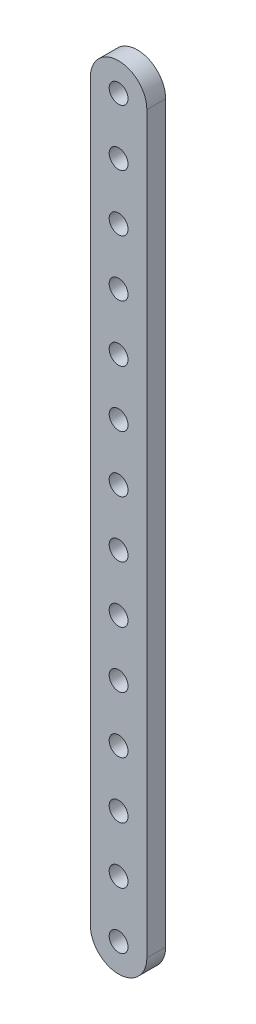
ISO-10303-21;
HEADER;
FILE_DESCRIPTION(('STEP AP214'),'2;1');
FILE_NAME('part.step','',(''),(''),'','','');
FILE_SCHEMA(('AUTOMOTIVE_DESIGN { 1 0 10303 214 1 1 1 1 }'));
ENDSEC;
DATA;
#1=APPLICATION_CONTEXT('core data for automotive mechanical design processes');
#2=APPLICATION_PROTOCOL_DEFINITION('international standard','automotive_design',2000,#1);
#3=PRODUCT_CONTEXT('',#1,'mechanical');
#4=PRODUCT('Part','Part','',(#3));
#5=PRODUCT_RELATED_PRODUCT_CATEGORY('part','',(#4));
#6=PRODUCT_DEFINITION_FORMATION('','',#4);
#7=PRODUCT_DEFINITION_CONTEXT('part definition',#1,'design');
#8=PRODUCT_DEFINITION('design','',#6,#7);
#9=PRODUCT_DEFINITION_SHAPE('','',#8);
#10=(LENGTH_UNIT() NAMED_UNIT(*) SI_UNIT(.MILLI.,.METRE.));
#11=(NAMED_UNIT(*) PLANE_ANGLE_UNIT() SI_UNIT($,.RADIAN.));
#12=(NAMED_UNIT(*) SI_UNIT($,.STERADIAN.) SOLID_ANGLE_UNIT());
#13=UNCERTAINTY_MEASURE_WITH_UNIT(LENGTH_MEASURE(1.E-05),#10,'distance_accuracy_value','');
#14=(GEOMETRIC_REPRESENTATION_CONTEXT(3) GLOBAL_UNCERTAINTY_ASSIGNED_CONTEXT((#13)) GLOBAL_UNIT_ASSIGNED_CONTEXT((#10,
#11,#12)) REPRESENTATION_CONTEXT('',''));
#15=CARTESIAN_POINT('',(0.,0.,0.));
#16=DIRECTION('',(0.,0.,1.));
#17=DIRECTION('',(1.,0.,0.));
#18=AXIS2_PLACEMENT_3D('',#15,#16,#17);
#19=CARTESIAN_POINT('',(208.7507761496,71.428489513,3.));
#20=DIRECTION('',(0.,0.,1.));
#21=DIRECTION('',(1.,0.,0.));
#22=AXIS2_PLACEMENT_3D('',#19,#20,#21);
#23=PLANE('',#22);
#24=CARTESIAN_POINT('',(208.7507761496,98.428489513,3.));
#25=DIRECTION('',(0.,0.,1.));
#26=DIRECTION('',(1.,0.,0.));
#27=AXIS2_PLACEMENT_3D('',#24,#25,#26);
#28=CIRCLE('',#27,1.5);
#29=CARTESIAN_POINT('',(210.2507761496,98.428489513,3.));
#30=VERTEX_POINT('',#29);
#31=EDGE_CURVE('E181',#30,#30,#28,.T.);
#32=ORIENTED_EDGE('',*,*,#31,.F.);
#33=EDGE_LOOP('',(#32));
#34=FACE_BOUND('',#33,.T.);
#35=CARTESIAN_POINT('',(208.7507761496,80.428489513,3.));
#36=DIRECTION('',(0.,0.,1.));
#37=DIRECTION('',(1.,0.,0.));
#38=AXIS2_PLACEMENT_3D('',#35,#36,#37);
#39=CIRCLE('',#38,1.5);
#40=CARTESIAN_POINT('',(210.2507761496,80.428489513,3.));
#41=VERTEX_POINT('',#40);
#42=EDGE_CURVE('E169',#41,#41,#39,.T.);
#43=ORIENTED_EDGE('',*,*,#42,.F.);
#44=EDGE_LOOP('',(#43));
#45=FACE_BOUND('',#44,.T.);
#46=CARTESIAN_POINT('',(208.7507761496,134.428489513,3.));
#47=DIRECTION('',(0.,0.,1.));
#48=DIRECTION('',(1.,0.,0.));
#49=AXIS2_PLACEMENT_3D('',#46,#47,#48);
#50=CIRCLE('',#49,1.5);
#51=CARTESIAN_POINT('',(210.2507761496,134.428489513,3.));
#52=VERTEX_POINT('',#51);
#53=EDGE_CURVE('E157',#52,#52,#50,.T.);
#54=ORIENTED_EDGE('',*,*,#53,.F.);
#55=EDGE_LOOP('',(#54));
#56=FACE_BOUND('',#55,.T.);
#57=CARTESIAN_POINT('',(208.7507761496,116.428489513,3.));
#58=DIRECTION('',(0.,0.,1.));
#59=DIRECTION('',(1.,0.,0.));
#60=AXIS2_PLACEMENT_3D('',#57,#58,#59);
#61=CIRCLE('',#60,1.5);
#62=CARTESIAN_POINT('',(210.2507761496,116.428489513,3.));
#63=VERTEX_POINT('',#62);
#64=EDGE_CURVE('E145',#63,#63,#61,.T.);
#65=ORIENTED_EDGE('',*,*,#64,.F.);
#66=EDGE_LOOP('',(#65));
#67=FACE_BOUND('',#66,.T.);
#68=CARTESIAN_POINT('',(208.7507761496,170.428489513,3.));
#69=DIRECTION('',(0.,0.,1.));
#70=DIRECTION('',(1.,0.,0.));
#71=AXIS2_PLACEMENT_3D('',#68,#69,#70);
#72=CIRCLE('',#71,1.5);
#73=CARTESIAN_POINT('',(210.2507761496,170.428489513,3.));
#74=VERTEX_POINT('',#73);
#75=EDGE_CURVE('E133',#74,#74,#72,.T.);
#76=ORIENTED_EDGE('',*,*,#75,.F.);
#77=EDGE_LOOP('',(#76));
#78=FACE_BOUND('',#77,.T.);
#79=CARTESIAN_POINT('',(208.7507761496,152.428489513,3.));
#80=DIRECTION('',(0.,0.,1.));
#81=DIRECTION('',(1.,0.,0.));
#82=AXIS2_PLACEMENT_3D('',#79,#80,#81);
#83=CIRCLE('',#82,1.5);
#84=CARTESIAN_POINT('',(210.2507761496,152.428489513,3.));
#85=VERTEX_POINT('',#84);
#86=EDGE_CURVE('E121',#85,#85,#83,.T.);
#87=ORIENTED_EDGE('',*,*,#86,.F.);
#88=EDGE_LOOP('',(#87));
#89=FACE_BOUND('',#88,.T.);
#90=CARTESIAN_POINT('',(208.7507761496,179.428489513,3.));
#91=DIRECTION('',(0.,0.,1.));
#92=DIRECTION('',(1.,0.,0.));
#93=AXIS2_PLACEMENT_3D('',#90,#91,#92);
#94=CIRCLE('',#93,1.5);
#95=CARTESIAN_POINT('',(210.2507761496,179.428489513,3.));
#96=VERTEX_POINT('',#95);
#97=EDGE_CURVE('E100',#96,#96,#94,.T.);
#98=ORIENTED_EDGE('',*,*,#97,.F.);
#99=EDGE_LOOP('',(#98));
#100=FACE_BOUND('',#99,.T.);
#101=CARTESIAN_POINT('',(208.7507761496,71.428489513,3.));
#102=DIRECTION('',(0.,0.,1.));
#103=DIRECTION('',(1.,0.,0.));
#104=AXIS2_PLACEMENT_3D('',#101,#102,#103);
#105=CIRCLE('',#104,4.5);
#106=CARTESIAN_POINT('',(204.2507761496,71.428489513,3.));
#107=VERTEX_POINT('',#106);
#108=CARTESIAN_POINT('',(213.2507761496,71.428489513,3.));
#109=VERTEX_POINT('',#108);
#110=EDGE_CURVE('E85',#107,#109,#105,.T.);
#111=ORIENTED_EDGE('',*,*,#110,.T.);
#112=DIRECTION('',(0.,1.,0.));
#113=VECTOR('',#112,1.);
#114=CARTESIAN_POINT('',(213.2507761496,71.428489513,3.));
#115=LINE('',#114,#113);
#116=CARTESIAN_POINT('',(213.2507761496,188.428489513,3.));
#117=VERTEX_POINT('',#116);
#118=EDGE_CURVE('E80',#109,#117,#115,.T.);
#119=ORIENTED_EDGE('',*,*,#118,.T.);
#120=CARTESIAN_POINT('',(208.7507761496,188.428489513,3.));
#121=DIRECTION('',(0.,0.,1.));
#122=DIRECTION('',(1.,0.,0.));
#123=AXIS2_PLACEMENT_3D('',#120,#121,#122);
#124=CIRCLE('',#123,4.5);
#125=CARTESIAN_POINT('',(204.2507761496,188.428489513,3.));
#126=VERTEX_POINT('',#125);
#127=EDGE_CURVE('E83',#117,#126,#124,.T.);
#128=ORIENTED_EDGE('',*,*,#127,.T.);
#129=DIRECTION('',(0.,-1.,0.));
#130=VECTOR('',#129,1.);
#131=CARTESIAN_POINT('',(204.2507761496,188.428489513,3.));
#132=LINE('',#131,#130);
#133=EDGE_CURVE('E50',#126,#107,#132,.T.);
#134=ORIENTED_EDGE('',*,*,#133,.T.);
#135=EDGE_LOOP('',(#111,#119,#128,#134));
#136=FACE_BOUND('',#135,.T.);
#137=CARTESIAN_POINT('',(208.7507761496,188.428489513,3.));
#138=DIRECTION('',(0.,0.,1.));
#139=DIRECTION('',(1.,0.,0.));
#140=AXIS2_PLACEMENT_3D('',#137,#138,#139);
#141=CIRCLE('',#140,1.5);
#142=CARTESIAN_POINT('',(210.2507761496,188.428489513,3.));
#143=VERTEX_POINT('',#142);
#144=EDGE_CURVE('E115',#143,#143,#141,.T.);
#145=ORIENTED_EDGE('',*,*,#144,.F.);
#146=EDGE_LOOP('',(#145));
#147=FACE_BOUND('',#146,.T.);
#148=CARTESIAN_POINT('',(208.7507761496,161.428489513,3.));
#149=DIRECTION('',(0.,0.,1.));
#150=DIRECTION('',(1.,0.,0.));
#151=AXIS2_PLACEMENT_3D('',#148,#149,#150);
#152=CIRCLE('',#151,1.5);
#153=CARTESIAN_POINT('',(210.2507761496,161.428489513,3.));
#154=VERTEX_POINT('',#153);
#155=EDGE_CURVE('E127',#154,#154,#152,.T.);
#156=ORIENTED_EDGE('',*,*,#155,.F.);
#157=EDGE_LOOP('',(#156));
#158=FACE_BOUND('',#157,.T.);
#159=CARTESIAN_POINT('',(208.7507761496,143.428489513,3.));
#160=DIRECTION('',(0.,0.,1.));
#161=DIRECTION('',(1.,0.,0.));
#162=AXIS2_PLACEMENT_3D('',#159,#160,#161);
#163=CIRCLE('',#162,1.5);
#164=CARTESIAN_POINT('',(210.2507761496,143.428489513,3.));
#165=VERTEX_POINT('',#164);
#166=EDGE_CURVE('E139',#165,#165,#163,.T.);
#167=ORIENTED_EDGE('',*,*,#166,.F.);
#168=EDGE_LOOP('',(#167));
#169=FACE_BOUND('',#168,.T.);
#170=CARTESIAN_POINT('',(208.7507761496,125.428489513,3.));
#171=DIRECTION('',(0.,0.,1.));
#172=DIRECTION('',(1.,0.,0.));
#173=AXIS2_PLACEMENT_3D('',#170,#171,#172);
#174=CIRCLE('',#173,1.5);
#175=CARTESIAN_POINT('',(210.2507761496,125.428489513,3.));
#176=VERTEX_POINT('',#175);
#177=EDGE_CURVE('E151',#176,#176,#174,.T.);
#178=ORIENTED_EDGE('',*,*,#177,.F.);
#179=EDGE_LOOP('',(#178));
#180=FACE_BOUND('',#179,.T.);
#181=CARTESIAN_POINT('',(208.7507761496,71.428489513,3.));
#182=DIRECTION('',(0.,0.,1.));
#183=DIRECTION('',(1.,0.,0.));
#184=AXIS2_PLACEMENT_3D('',#181,#182,#183);
#185=CIRCLE('',#184,1.5);
#186=CARTESIAN_POINT('',(210.2507761496,71.428489513,3.));
#187=VERTEX_POINT('',#186);
#188=EDGE_CURVE('E163',#187,#187,#185,.T.);
#189=ORIENTED_EDGE('',*,*,#188,.F.);
#190=EDGE_LOOP('',(#189));
#191=FACE_BOUND('',#190,.T.);
#192=CARTESIAN_POINT('',(208.7507761496,89.428489513,3.));
#193=DIRECTION('',(0.,0.,1.));
#194=DIRECTION('',(1.,0.,0.));
#195=AXIS2_PLACEMENT_3D('',#192,#193,#194);
#196=CIRCLE('',#195,1.5);
#197=CARTESIAN_POINT('',(210.2507761496,89.428489513,3.));
#198=VERTEX_POINT('',#197);
#199=EDGE_CURVE('E175',#198,#198,#196,.T.);
#200=ORIENTED_EDGE('',*,*,#199,.F.);
#201=EDGE_LOOP('',(#200));
#202=FACE_BOUND('',#201,.T.);
#203=CARTESIAN_POINT('',(208.7507761496,107.428489513,3.));
#204=DIRECTION('',(0.,0.,1.));
#205=DIRECTION('',(1.,0.,0.));
#206=AXIS2_PLACEMENT_3D('',#203,#204,#205);
#207=CIRCLE('',#206,1.5);
#208=CARTESIAN_POINT('',(210.2507761496,107.428489513,3.));
#209=VERTEX_POINT('',#208);
#210=EDGE_CURVE('E187',#209,#209,#207,.T.);
#211=ORIENTED_EDGE('',*,*,#210,.F.);
#212=EDGE_LOOP('',(#211));
#213=FACE_BOUND('',#212,.T.);
#214=ADVANCED_FACE('F33',(#34,#45,#56,#67,#78,#89,#100,#136,#147,#158,#169,#180,#191,#202,#213),
#23,.T.);
#215=CARTESIAN_POINT('',(208.7507761496,71.428489513,0.));
#216=DIRECTION('',(0.,0.,1.));
#217=DIRECTION('',(1.,0.,0.));
#218=AXIS2_PLACEMENT_3D('',#215,#216,#217);
#219=PLANE('',#218);
#220=CARTESIAN_POINT('',(208.7507761496,98.428489513,0.));
#221=DIRECTION('',(0.,0.,1.));
#222=DIRECTION('',(1.,0.,0.));
#223=AXIS2_PLACEMENT_3D('',#220,#221,#222);
#224=CIRCLE('',#223,1.5);
#225=CARTESIAN_POINT('',(210.2507761496,98.428489513,0.));
#226=VERTEX_POINT('',#225);
#227=EDGE_CURVE('E184',#226,#226,#224,.T.);
#228=ORIENTED_EDGE('',*,*,#227,.T.);
#229=EDGE_LOOP('',(#228));
#230=FACE_BOUND('',#229,.T.);
#231=CARTESIAN_POINT('',(208.7507761496,80.428489513,0.));
#232=DIRECTION('',(0.,0.,1.));
#233=DIRECTION('',(1.,0.,0.));
#234=AXIS2_PLACEMENT_3D('',#231,#232,#233);
#235=CIRCLE('',#234,1.5);
#236=CARTESIAN_POINT('',(210.2507761496,80.428489513,0.));
#237=VERTEX_POINT('',#236);
#238=EDGE_CURVE('E172',#237,#237,#235,.T.);
#239=ORIENTED_EDGE('',*,*,#238,.T.);
#240=EDGE_LOOP('',(#239));
#241=FACE_BOUND('',#240,.T.);
#242=CARTESIAN_POINT('',(208.7507761496,134.428489513,0.));
#243=DIRECTION('',(0.,0.,1.));
#244=DIRECTION('',(1.,0.,0.));
#245=AXIS2_PLACEMENT_3D('',#242,#243,#244);
#246=CIRCLE('',#245,1.5);
#247=CARTESIAN_POINT('',(210.2507761496,134.428489513,0.));
#248=VERTEX_POINT('',#247);
#249=EDGE_CURVE('E160',#248,#248,#246,.T.);
#250=ORIENTED_EDGE('',*,*,#249,.T.);
#251=EDGE_LOOP('',(#250));
#252=FACE_BOUND('',#251,.T.);
#253=CARTESIAN_POINT('',(208.7507761496,116.428489513,0.));
#254=DIRECTION('',(0.,0.,1.));
#255=DIRECTION('',(1.,0.,0.));
#256=AXIS2_PLACEMENT_3D('',#253,#254,#255);
#257=CIRCLE('',#256,1.5);
#258=CARTESIAN_POINT('',(210.2507761496,116.428489513,0.));
#259=VERTEX_POINT('',#258);
#260=EDGE_CURVE('E148',#259,#259,#257,.T.);
#261=ORIENTED_EDGE('',*,*,#260,.T.);
#262=EDGE_LOOP('',(#261));
#263=FACE_BOUND('',#262,.T.);
#264=CARTESIAN_POINT('',(208.7507761496,170.428489513,0.));
#265=DIRECTION('',(0.,0.,1.));
#266=DIRECTION('',(1.,0.,0.));
#267=AXIS2_PLACEMENT_3D('',#264,#265,#266);
#268=CIRCLE('',#267,1.5);
#269=CARTESIAN_POINT('',(210.2507761496,170.428489513,0.));
#270=VERTEX_POINT('',#269);
#271=EDGE_CURVE('E136',#270,#270,#268,.T.);
#272=ORIENTED_EDGE('',*,*,#271,.T.);
#273=EDGE_LOOP('',(#272));
#274=FACE_BOUND('',#273,.T.);
#275=CARTESIAN_POINT('',(208.7507761496,152.428489513,0.));
#276=DIRECTION('',(0.,0.,1.));
#277=DIRECTION('',(1.,0.,0.));
#278=AXIS2_PLACEMENT_3D('',#275,#276,#277);
#279=CIRCLE('',#278,1.5);
#280=CARTESIAN_POINT('',(210.2507761496,152.428489513,0.));
#281=VERTEX_POINT('',#280);
#282=EDGE_CURVE('E124',#281,#281,#279,.T.);
#283=ORIENTED_EDGE('',*,*,#282,.T.);
#284=EDGE_LOOP('',(#283));
#285=FACE_BOUND('',#284,.T.);
#286=CARTESIAN_POINT('',(208.7507761496,179.428489513,0.));
#287=DIRECTION('',(0.,0.,1.));
#288=DIRECTION('',(1.,0.,0.));
#289=AXIS2_PLACEMENT_3D('',#286,#287,#288);
#290=CIRCLE('',#289,1.5);
#291=CARTESIAN_POINT('',(210.2507761496,179.428489513,0.));
#292=VERTEX_POINT('',#291);
#293=EDGE_CURVE('E112',#292,#292,#290,.T.);
#294=ORIENTED_EDGE('',*,*,#293,.T.);
#295=EDGE_LOOP('',(#294));
#296=FACE_BOUND('',#295,.T.);
#297=CARTESIAN_POINT('',(208.7507761496,71.428489513,0.));
#298=DIRECTION('',(0.,0.,1.));
#299=DIRECTION('',(1.,0.,0.));
#300=AXIS2_PLACEMENT_3D('',#297,#298,#299);
#301=CIRCLE('',#300,4.5);
#302=CARTESIAN_POINT('',(204.2507761496,71.428489513,0.));
#303=VERTEX_POINT('',#302);
#304=CARTESIAN_POINT('',(213.2507761496,71.428489513,0.));
#305=VERTEX_POINT('',#304);
#306=EDGE_CURVE('E97',#303,#305,#301,.T.);
#307=ORIENTED_EDGE('',*,*,#306,.F.);
#308=DIRECTION('',(0.,-1.,0.));
#309=VECTOR('',#308,1.);
#310=CARTESIAN_POINT('',(204.2507761496,188.428489513,0.));
#311=LINE('',#310,#309);
#312=CARTESIAN_POINT('',(204.2507761496,188.428489513,0.));
#313=VERTEX_POINT('',#312);
#314=EDGE_CURVE('E73',#313,#303,#311,.T.);
#315=ORIENTED_EDGE('',*,*,#314,.F.);
#316=CARTESIAN_POINT('',(208.7507761496,188.428489513,0.));
#317=DIRECTION('',(0.,0.,1.));
#318=DIRECTION('',(1.,0.,0.));
#319=AXIS2_PLACEMENT_3D('',#316,#317,#318);
#320=CIRCLE('',#319,4.5);
#321=CARTESIAN_POINT('',(213.2507761496,188.428489513,0.));
#322=VERTEX_POINT('',#321);
#323=EDGE_CURVE('E67',#322,#313,#320,.T.);
#324=ORIENTED_EDGE('',*,*,#323,.F.);
#325=DIRECTION('',(0.,1.,0.));
#326=VECTOR('',#325,1.);
#327=CARTESIAN_POINT('',(213.2507761496,71.428489513,0.));
#328=LINE('',#327,#326);
#329=EDGE_CURVE('E89',#305,#322,#328,.T.);
#330=ORIENTED_EDGE('',*,*,#329,.F.);
#331=EDGE_LOOP('',(#307,#315,#324,#330));
#332=FACE_BOUND('',#331,.T.);
#333=CARTESIAN_POINT('',(208.7507761496,188.428489513,0.));
#334=DIRECTION('',(0.,0.,1.));
#335=DIRECTION('',(1.,0.,0.));
#336=AXIS2_PLACEMENT_3D('',#333,#334,#335);
#337=CIRCLE('',#336,1.5);
#338=CARTESIAN_POINT('',(210.2507761496,188.428489513,0.));
#339=VERTEX_POINT('',#338);
#340=EDGE_CURVE('E118',#339,#339,#337,.T.);
#341=ORIENTED_EDGE('',*,*,#340,.T.);
#342=EDGE_LOOP('',(#341));
#343=FACE_BOUND('',#342,.T.);
#344=CARTESIAN_POINT('',(208.7507761496,161.428489513,0.));
#345=DIRECTION('',(0.,0.,1.));
#346=DIRECTION('',(1.,0.,0.));
#347=AXIS2_PLACEMENT_3D('',#344,#345,#346);
#348=CIRCLE('',#347,1.5);
#349=CARTESIAN_POINT('',(210.2507761496,161.428489513,0.));
#350=VERTEX_POINT('',#349);
#351=EDGE_CURVE('E130',#350,#350,#348,.T.);
#352=ORIENTED_EDGE('',*,*,#351,.T.);
#353=EDGE_LOOP('',(#352));
#354=FACE_BOUND('',#353,.T.);
#355=CARTESIAN_POINT('',(208.7507761496,143.428489513,0.));
#356=DIRECTION('',(0.,0.,1.));
#357=DIRECTION('',(1.,0.,0.));
#358=AXIS2_PLACEMENT_3D('',#355,#356,#357);
#359=CIRCLE('',#358,1.5);
#360=CARTESIAN_POINT('',(210.2507761496,143.428489513,0.));
#361=VERTEX_POINT('',#360);
#362=EDGE_CURVE('E142',#361,#361,#359,.T.);
#363=ORIENTED_EDGE('',*,*,#362,.T.);
#364=EDGE_LOOP('',(#363));
#365=FACE_BOUND('',#364,.T.);
#366=CARTESIAN_POINT('',(208.7507761496,125.428489513,0.));
#367=DIRECTION('',(0.,0.,1.));
#368=DIRECTION('',(1.,0.,0.));
#369=AXIS2_PLACEMENT_3D('',#366,#367,#368);
#370=CIRCLE('',#369,1.5);
#371=CARTESIAN_POINT('',(210.2507761496,125.428489513,0.));
#372=VERTEX_POINT('',#371);
#373=EDGE_CURVE('E154',#372,#372,#370,.T.);
#374=ORIENTED_EDGE('',*,*,#373,.T.);
#375=EDGE_LOOP('',(#374));
#376=FACE_BOUND('',#375,.T.);
#377=CARTESIAN_POINT('',(208.7507761496,71.428489513,0.));
#378=DIRECTION('',(0.,0.,1.));
#379=DIRECTION('',(1.,0.,0.));
#380=AXIS2_PLACEMENT_3D('',#377,#378,#379);
#381=CIRCLE('',#380,1.5);
#382=CARTESIAN_POINT('',(210.2507761496,71.428489513,0.));
#383=VERTEX_POINT('',#382);
#384=EDGE_CURVE('E166',#383,#383,#381,.T.);
#385=ORIENTED_EDGE('',*,*,#384,.T.);
#386=EDGE_LOOP('',(#385));
#387=FACE_BOUND('',#386,.T.);
#388=CARTESIAN_POINT('',(208.7507761496,89.428489513,0.));
#389=DIRECTION('',(0.,0.,1.));
#390=DIRECTION('',(1.,0.,0.));
#391=AXIS2_PLACEMENT_3D('',#388,#389,#390);
#392=CIRCLE('',#391,1.5);
#393=CARTESIAN_POINT('',(210.2507761496,89.428489513,0.));
#394=VERTEX_POINT('',#393);
#395=EDGE_CURVE('E178',#394,#394,#392,.T.);
#396=ORIENTED_EDGE('',*,*,#395,.T.);
#397=EDGE_LOOP('',(#396));
#398=FACE_BOUND('',#397,.T.);
#399=CARTESIAN_POINT('',(208.7507761496,107.428489513,0.));
#400=DIRECTION('',(0.,0.,1.));
#401=DIRECTION('',(1.,0.,0.));
#402=AXIS2_PLACEMENT_3D('',#399,#400,#401);
#403=CIRCLE('',#402,1.5);
#404=CARTESIAN_POINT('',(210.2507761496,107.428489513,0.));
#405=VERTEX_POINT('',#404);
#406=EDGE_CURVE('E190',#405,#405,#403,.T.);
#407=ORIENTED_EDGE('',*,*,#406,.T.);
#408=EDGE_LOOP('',(#407));
#409=FACE_BOUND('',#408,.T.);
#410=ADVANCED_FACE('F108',(#230,#241,#252,#263,#274,#285,#296,#332,#343,#354,#365,#376,#387,
#398,#409),#219,.F.);
#411=CARTESIAN_POINT('',(208.7507761496,71.428489513,3.));
#412=DIRECTION('',(0.,0.,-1.));
#413=DIRECTION('',(-1.,0.,0.));
#414=AXIS2_PLACEMENT_3D('',#411,#412,#413);
#415=CYLINDRICAL_SURFACE('',#414,4.5);
#416=ORIENTED_EDGE('',*,*,#306,.T.);
#417=DIRECTION('',(0.,0.,-1.));
#418=VECTOR('',#417,1.);
#419=CARTESIAN_POINT('',(213.2507761496,71.428489513,3.));
#420=LINE('',#419,#418);
#421=EDGE_CURVE('E11',#109,#305,#420,.T.);
#422=ORIENTED_EDGE('',*,*,#421,.F.);
#423=ORIENTED_EDGE('',*,*,#110,.F.);
#424=DIRECTION('',(0.,0.,-1.));
#425=VECTOR('',#424,1.);
#426=CARTESIAN_POINT('',(204.2507761496,71.428489513,3.));
#427=LINE('',#426,#425);
#428=EDGE_CURVE('E93',#107,#303,#427,.T.);
#429=ORIENTED_EDGE('',*,*,#428,.T.);
#430=EDGE_LOOP('',(#416,#422,#423,#429));
#431=FACE_BOUND('',#430,.T.);
#432=ADVANCED_FACE('F35',(#431),#415,.T.);
#433=CARTESIAN_POINT('',(213.2507761496,71.428489513,3.));
#434=DIRECTION('',(-1.,0.,0.));
#435=DIRECTION('',(0.,0.,1.));
#436=AXIS2_PLACEMENT_3D('',#433,#434,#435);
#437=PLANE('',#436);
#438=ORIENTED_EDGE('',*,*,#329,.T.);
#439=DIRECTION('',(0.,0.,-1.));
#440=VECTOR('',#439,1.);
#441=CARTESIAN_POINT('',(213.2507761496,188.428489513,3.));
#442=LINE('',#441,#440);
#443=EDGE_CURVE('E42',#117,#322,#442,.T.);
#444=ORIENTED_EDGE('',*,*,#443,.F.);
#445=ORIENTED_EDGE('',*,*,#118,.F.);
#446=ORIENTED_EDGE('',*,*,#421,.T.);
#447=EDGE_LOOP('',(#438,#444,#445,#446));
#448=FACE_BOUND('',#447,.T.);
#449=ADVANCED_FACE('F88',(#448),#437,.F.);
#450=CARTESIAN_POINT('',(208.7507761496,188.428489513,3.));
#451=DIRECTION('',(0.,0.,-1.));
#452=DIRECTION('',(-1.,0.,0.));
#453=AXIS2_PLACEMENT_3D('',#450,#451,#452);
#454=CYLINDRICAL_SURFACE('',#453,4.5);
#455=ORIENTED_EDGE('',*,*,#323,.T.);
#456=DIRECTION('',(0.,0.,-1.));
#457=VECTOR('',#456,1.);
#458=CARTESIAN_POINT('',(204.2507761496,188.428489513,3.));
#459=LINE('',#458,#457);
#460=EDGE_CURVE('E90',#126,#313,#459,.T.);
#461=ORIENTED_EDGE('',*,*,#460,.F.);
#462=ORIENTED_EDGE('',*,*,#127,.F.);
#463=ORIENTED_EDGE('',*,*,#443,.T.);
#464=EDGE_LOOP('',(#455,#461,#462,#463));
#465=FACE_BOUND('',#464,.T.);
#466=ADVANCED_FACE('F91',(#465),#454,.T.);
#467=CARTESIAN_POINT('',(204.2507761496,188.428489513,3.));
#468=DIRECTION('',(1.,0.,0.));
#469=DIRECTION('',(0.,0.,-1.));
#470=AXIS2_PLACEMENT_3D('',#467,#468,#469);
#471=PLANE('',#470);
#472=ORIENTED_EDGE('',*,*,#314,.T.);
#473=ORIENTED_EDGE('',*,*,#428,.F.);
#474=ORIENTED_EDGE('',*,*,#133,.F.);
#475=ORIENTED_EDGE('',*,*,#460,.T.);
#476=EDGE_LOOP('',(#472,#473,#474,#475));
#477=FACE_BOUND('',#476,.T.);
#478=ADVANCED_FACE('F105',(#477),#471,.F.);
#479=CARTESIAN_POINT('',(208.7507761496,179.428489513,3.));
#480=DIRECTION('',(0.,0.,-1.));
#481=DIRECTION('',(-1.,0.,0.));
#482=AXIS2_PLACEMENT_3D('',#479,#480,#481);
#483=CYLINDRICAL_SURFACE('',#482,1.5);
#484=ORIENTED_EDGE('',*,*,#97,.T.);
#485=EDGE_LOOP('',(#484));
#486=FACE_BOUND('',#485,.T.);
#487=ORIENTED_EDGE('',*,*,#293,.F.);
#488=EDGE_LOOP('',(#487));
#489=FACE_BOUND('',#488,.T.);
#490=ADVANCED_FACE('F210',(#486,#489),#483,.F.);
#491=CARTESIAN_POINT('',(208.7507761496,188.428489513,3.));
#492=DIRECTION('',(0.,0.,-1.));
#493=DIRECTION('',(-1.,0.,0.));
#494=AXIS2_PLACEMENT_3D('',#491,#492,#493);
#495=CYLINDRICAL_SURFACE('',#494,1.5);
#496=ORIENTED_EDGE('',*,*,#144,.T.);
#497=EDGE_LOOP('',(#496));
#498=FACE_BOUND('',#497,.T.);
#499=ORIENTED_EDGE('',*,*,#340,.F.);
#500=EDGE_LOOP('',(#499));
#501=FACE_BOUND('',#500,.T.);
#502=ADVANCED_FACE('F256',(#498,#501),#495,.F.);
#503=CARTESIAN_POINT('',(208.7507761496,152.428489513,3.));
#504=DIRECTION('',(0.,0.,-1.));
#505=DIRECTION('',(-1.,0.,0.));
#506=AXIS2_PLACEMENT_3D('',#503,#504,#505);
#507=CYLINDRICAL_SURFACE('',#506,1.5);
#508=ORIENTED_EDGE('',*,*,#86,.T.);
#509=EDGE_LOOP('',(#508));
#510=FACE_BOUND('',#509,.T.);
#511=ORIENTED_EDGE('',*,*,#282,.F.);
#512=EDGE_LOOP('',(#511));
#513=FACE_BOUND('',#512,.T.);
#514=ADVANCED_FACE('F264',(#510,#513),#507,.F.);
#515=CARTESIAN_POINT('',(208.7507761496,161.428489513,3.));
#516=DIRECTION('',(0.,0.,-1.));
#517=DIRECTION('',(-1.,0.,0.));
#518=AXIS2_PLACEMENT_3D('',#515,#516,#517);
#519=CYLINDRICAL_SURFACE('',#518,1.5);
#520=ORIENTED_EDGE('',*,*,#155,.T.);
#521=EDGE_LOOP('',(#520));
#522=FACE_BOUND('',#521,.T.);
#523=ORIENTED_EDGE('',*,*,#351,.F.);
#524=EDGE_LOOP('',(#523));
#525=FACE_BOUND('',#524,.T.);
#526=ADVANCED_FACE('F272',(#522,#525),#519,.F.);
#527=CARTESIAN_POINT('',(208.7507761496,170.428489513,3.));
#528=DIRECTION('',(0.,0.,-1.));
#529=DIRECTION('',(-1.,0.,0.));
#530=AXIS2_PLACEMENT_3D('',#527,#528,#529);
#531=CYLINDRICAL_SURFACE('',#530,1.5);
#532=ORIENTED_EDGE('',*,*,#75,.T.);
#533=EDGE_LOOP('',(#532));
#534=FACE_BOUND('',#533,.T.);
#535=ORIENTED_EDGE('',*,*,#271,.F.);
#536=EDGE_LOOP('',(#535));
#537=FACE_BOUND('',#536,.T.);
#538=ADVANCED_FACE('F281',(#534,#537),#531,.F.);
#539=CARTESIAN_POINT('',(208.7507761496,143.428489513,3.));
#540=DIRECTION('',(0.,0.,-1.));
#541=DIRECTION('',(-1.,0.,0.));
#542=AXIS2_PLACEMENT_3D('',#539,#540,#541);
#543=CYLINDRICAL_SURFACE('',#542,1.5);
#544=ORIENTED_EDGE('',*,*,#166,.T.);
#545=EDGE_LOOP('',(#544));
#546=FACE_BOUND('',#545,.T.);
#547=ORIENTED_EDGE('',*,*,#362,.F.);
#548=EDGE_LOOP('',(#547));
#549=FACE_BOUND('',#548,.T.);
#550=ADVANCED_FACE('F290',(#546,#549),#543,.F.);
#551=CARTESIAN_POINT('',(208.7507761496,116.428489513,3.));
#552=DIRECTION('',(0.,0.,-1.));
#553=DIRECTION('',(-1.,0.,0.));
#554=AXIS2_PLACEMENT_3D('',#551,#552,#553);
#555=CYLINDRICAL_SURFACE('',#554,1.5);
#556=ORIENTED_EDGE('',*,*,#64,.T.);
#557=EDGE_LOOP('',(#556));
#558=FACE_BOUND('',#557,.T.);
#559=ORIENTED_EDGE('',*,*,#260,.F.);
#560=EDGE_LOOP('',(#559));
#561=FACE_BOUND('',#560,.T.);
#562=ADVANCED_FACE('F299',(#558,#561),#555,.F.);
#563=CARTESIAN_POINT('',(208.7507761496,125.428489513,3.));
#564=DIRECTION('',(0.,0.,-1.));
#565=DIRECTION('',(-1.,0.,0.));
#566=AXIS2_PLACEMENT_3D('',#563,#564,#565);
#567=CYLINDRICAL_SURFACE('',#566,1.5);
#568=ORIENTED_EDGE('',*,*,#177,.T.);
#569=EDGE_LOOP('',(#568));
#570=FACE_BOUND('',#569,.T.);
#571=ORIENTED_EDGE('',*,*,#373,.F.);
#572=EDGE_LOOP('',(#571));
#573=FACE_BOUND('',#572,.T.);
#574=ADVANCED_FACE('F308',(#570,#573),#567,.F.);
#575=CARTESIAN_POINT('',(208.7507761496,134.428489513,3.));
#576=DIRECTION('',(0.,0.,-1.));
#577=DIRECTION('',(-1.,0.,0.));
#578=AXIS2_PLACEMENT_3D('',#575,#576,#577);
#579=CYLINDRICAL_SURFACE('',#578,1.5);
#580=ORIENTED_EDGE('',*,*,#53,.T.);
#581=EDGE_LOOP('',(#580));
#582=FACE_BOUND('',#581,.T.);
#583=ORIENTED_EDGE('',*,*,#249,.F.);
#584=EDGE_LOOP('',(#583));
#585=FACE_BOUND('',#584,.T.);
#586=ADVANCED_FACE('F317',(#582,#585),#579,.F.);
#587=CARTESIAN_POINT('',(208.7507761496,71.428489513,3.));
#588=DIRECTION('',(0.,0.,-1.));
#589=DIRECTION('',(-1.,0.,0.));
#590=AXIS2_PLACEMENT_3D('',#587,#588,#589);
#591=CYLINDRICAL_SURFACE('',#590,1.5);
#592=ORIENTED_EDGE('',*,*,#188,.T.);
#593=EDGE_LOOP('',(#592));
#594=FACE_BOUND('',#593,.T.);
#595=ORIENTED_EDGE('',*,*,#384,.F.);
#596=EDGE_LOOP('',(#595));
#597=FACE_BOUND('',#596,.T.);
#598=ADVANCED_FACE('F326',(#594,#597),#591,.F.);
#599=CARTESIAN_POINT('',(208.7507761496,80.428489513,3.));
#600=DIRECTION('',(0.,0.,-1.));
#601=DIRECTION('',(-1.,0.,0.));
#602=AXIS2_PLACEMENT_3D('',#599,#600,#601);
#603=CYLINDRICAL_SURFACE('',#602,1.5);
#604=ORIENTED_EDGE('',*,*,#42,.T.);
#605=EDGE_LOOP('',(#604));
#606=FACE_BOUND('',#605,.T.);
#607=ORIENTED_EDGE('',*,*,#238,.F.);
#608=EDGE_LOOP('',(#607));
#609=FACE_BOUND('',#608,.T.);
#610=ADVANCED_FACE('F335',(#606,#609),#603,.F.);
#611=CARTESIAN_POINT('',(208.7507761496,89.428489513,3.));
#612=DIRECTION('',(0.,0.,-1.));
#613=DIRECTION('',(-1.,0.,0.));
#614=AXIS2_PLACEMENT_3D('',#611,#612,#613);
#615=CYLINDRICAL_SURFACE('',#614,1.5);
#616=ORIENTED_EDGE('',*,*,#199,.T.);
#617=EDGE_LOOP('',(#616));
#618=FACE_BOUND('',#617,.T.);
#619=ORIENTED_EDGE('',*,*,#395,.F.);
#620=EDGE_LOOP('',(#619));
#621=FACE_BOUND('',#620,.T.);
#622=ADVANCED_FACE('F344',(#618,#621),#615,.F.);
#623=CARTESIAN_POINT('',(208.7507761496,98.428489513,3.));
#624=DIRECTION('',(0.,0.,-1.));
#625=DIRECTION('',(-1.,0.,0.));
#626=AXIS2_PLACEMENT_3D('',#623,#624,#625);
#627=CYLINDRICAL_SURFACE('',#626,1.5);
#628=ORIENTED_EDGE('',*,*,#31,.T.);
#629=EDGE_LOOP('',(#628));
#630=FACE_BOUND('',#629,.T.);
#631=ORIENTED_EDGE('',*,*,#227,.F.);
#632=EDGE_LOOP('',(#631));
#633=FACE_BOUND('',#632,.T.);
#634=ADVANCED_FACE('F353',(#630,#633),#627,.F.);
#635=CARTESIAN_POINT('',(208.7507761496,107.428489513,3.));
#636=DIRECTION('',(0.,0.,-1.));
#637=DIRECTION('',(-1.,0.,0.));
#638=AXIS2_PLACEMENT_3D('',#635,#636,#637);
#639=CYLINDRICAL_SURFACE('',#638,1.5);
#640=ORIENTED_EDGE('',*,*,#210,.T.);
#641=EDGE_LOOP('',(#640));
#642=FACE_BOUND('',#641,.T.);
#643=ORIENTED_EDGE('',*,*,#406,.F.);
#644=EDGE_LOOP('',(#643));
#645=FACE_BOUND('',#644,.T.);
#646=ADVANCED_FACE('F196',(#642,#645),#639,.F.);
#647=CLOSED_SHELL('',(#214,#410,#432,#449,#466,#478,#490,#502,#514,#526,#538,#550,#562,#574,
#586,#598,#610,#622,#634,#646));
#648=MANIFOLD_SOLID_BREP('B2',#647);
#649=ADVANCED_BREP_SHAPE_REPRESENTATION('',(#18,#648),#14);
#650=SHAPE_DEFINITION_REPRESENTATION(#9,#649);
ENDSEC;
END-ISO-10303-21;
